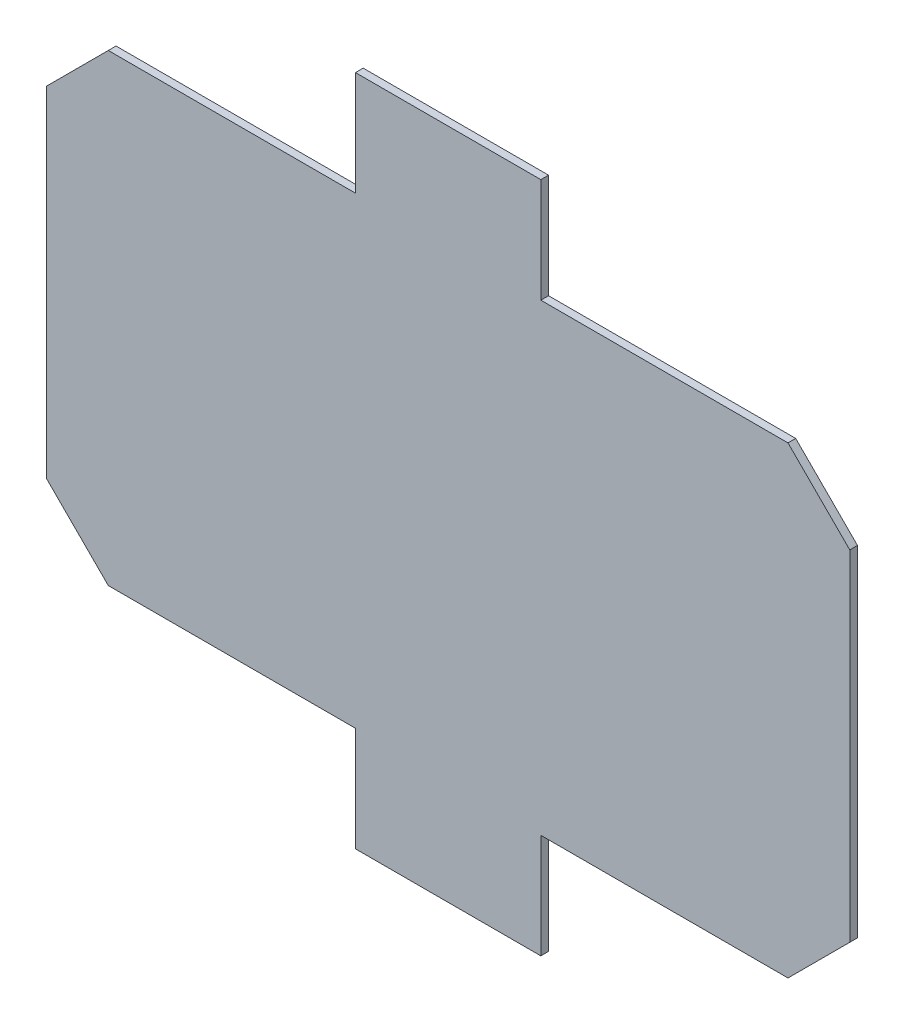
ISO-10303-21;
HEADER;
FILE_DESCRIPTION(('STEP AP214'),'2;1');
FILE_NAME('part.step','',(''),(''),'','','');
FILE_SCHEMA(('AUTOMOTIVE_DESIGN { 1 0 10303 214 1 1 1 1 }'));
ENDSEC;
DATA;
#1=APPLICATION_CONTEXT('core data for automotive mechanical design processes');
#2=APPLICATION_PROTOCOL_DEFINITION('international standard','automotive_design',2000,#1);
#3=PRODUCT_CONTEXT('',#1,'mechanical');
#4=PRODUCT('Part','Part','',(#3));
#5=PRODUCT_RELATED_PRODUCT_CATEGORY('part','',(#4));
#6=PRODUCT_DEFINITION_FORMATION('','',#4);
#7=PRODUCT_DEFINITION_CONTEXT('part definition',#1,'design');
#8=PRODUCT_DEFINITION('design','',#6,#7);
#9=PRODUCT_DEFINITION_SHAPE('','',#8);
#10=(LENGTH_UNIT() NAMED_UNIT(*) SI_UNIT(.MILLI.,.METRE.));
#11=(NAMED_UNIT(*) PLANE_ANGLE_UNIT() SI_UNIT($,.RADIAN.));
#12=(NAMED_UNIT(*) SI_UNIT($,.STERADIAN.) SOLID_ANGLE_UNIT());
#13=UNCERTAINTY_MEASURE_WITH_UNIT(LENGTH_MEASURE(1.E-05),#10,'distance_accuracy_value','');
#14=(GEOMETRIC_REPRESENTATION_CONTEXT(3) GLOBAL_UNCERTAINTY_ASSIGNED_CONTEXT((#13)) GLOBAL_UNIT_ASSIGNED_CONTEXT((#10,
#11,#12)) REPRESENTATION_CONTEXT('',''));
#15=CARTESIAN_POINT('',(0.,0.,0.));
#16=DIRECTION('',(0.,0.,1.));
#17=DIRECTION('',(1.,0.,0.));
#18=AXIS2_PLACEMENT_3D('',#15,#16,#17);
#19=CARTESIAN_POINT('',(-59.9999999999999,0.,5.));
#20=DIRECTION('',(-1.,0.,0.));
#21=DIRECTION('',(0.,0.,1.));
#22=AXIS2_PLACEMENT_3D('',#19,#20,#21);
#23=PLANE('',#22);
#24=DIRECTION('',(0.,1.,0.));
#25=VECTOR('',#24,1.);
#26=CARTESIAN_POINT('',(-59.9999999999999,0.,0.));
#27=LINE('',#26,#25);
#28=CARTESIAN_POINT('',(-59.9999999999999,325.,0.));
#29=VERTEX_POINT('',#28);
#30=CARTESIAN_POINT('',(-59.9999999999999,392.6,0.));
#31=VERTEX_POINT('',#30);
#32=EDGE_CURVE('E166',#29,#31,#27,.T.);
#33=ORIENTED_EDGE('',*,*,#32,.F.);
#34=DIRECTION('',(0.,0.,-1.));
#35=VECTOR('',#34,1.);
#36=CARTESIAN_POINT('',(-59.9999999999999,325.,5.));
#37=LINE('',#36,#35);
#38=CARTESIAN_POINT('',(-59.9999999999999,325.,5.));
#39=VERTEX_POINT('',#38);
#40=EDGE_CURVE('E154',#39,#29,#37,.T.);
#41=ORIENTED_EDGE('',*,*,#40,.F.);
#42=DIRECTION('',(0.,1.,0.));
#43=VECTOR('',#42,1.);
#44=CARTESIAN_POINT('',(-59.9999999999999,0.,5.));
#45=LINE('',#44,#43);
#46=CARTESIAN_POINT('',(-59.9999999999999,392.6,5.));
#47=VERTEX_POINT('',#46);
#48=EDGE_CURVE('E160',#39,#47,#45,.T.);
#49=ORIENTED_EDGE('',*,*,#48,.T.);
#50=DIRECTION('',(0.,0.,-1.));
#51=VECTOR('',#50,1.);
#52=CARTESIAN_POINT('',(-59.9999999999999,392.6,5.));
#53=LINE('',#52,#51);
#54=EDGE_CURVE('E200',#47,#31,#53,.T.);
#55=ORIENTED_EDGE('',*,*,#54,.T.);
#56=EDGE_LOOP('',(#33,#41,#49,#55));
#57=FACE_BOUND('',#56,.T.);
#58=ADVANCED_FACE('F35',(#57),#23,.T.);
#59=CARTESIAN_POINT('',(0.,325.,5.));
#60=DIRECTION('',(0.,1.,0.));
#61=DIRECTION('',(0.,0.,1.));
#62=AXIS2_PLACEMENT_3D('',#59,#60,#61);
#63=PLANE('',#62);
#64=DIRECTION('',(1.,0.,0.));
#65=VECTOR('',#64,1.);
#66=CARTESIAN_POINT('',(0.,325.,0.));
#67=LINE('',#66,#65);
#68=CARTESIAN_POINT('',(-220.,325.,0.));
#69=VERTEX_POINT('',#68);
#70=EDGE_CURVE('E202',#69,#29,#67,.T.);
#71=ORIENTED_EDGE('',*,*,#70,.F.);
#72=DIRECTION('',(0.,0.,1.));
#73=VECTOR('',#72,1.);
#74=CARTESIAN_POINT('',(-220.,325.,5.));
#75=LINE('',#74,#73);
#76=CARTESIAN_POINT('',(-220.,325.,5.));
#77=VERTEX_POINT('',#76);
#78=EDGE_CURVE('E43',#69,#77,#75,.T.);
#79=ORIENTED_EDGE('',*,*,#78,.T.);
#80=DIRECTION('',(1.,0.,0.));
#81=VECTOR('',#80,1.);
#82=CARTESIAN_POINT('',(0.,325.,5.));
#83=LINE('',#82,#81);
#84=EDGE_CURVE('E150',#77,#39,#83,.T.);
#85=ORIENTED_EDGE('',*,*,#84,.T.);
#86=ORIENTED_EDGE('',*,*,#40,.T.);
#87=EDGE_LOOP('',(#71,#79,#85,#86));
#88=FACE_BOUND('',#87,.T.);
#89=ADVANCED_FACE('F153',(#88),#63,.T.);
#90=CARTESIAN_POINT('',(-260.,0.,5.));
#91=DIRECTION('',(-1.,0.,0.));
#92=DIRECTION('',(0.,0.,1.));
#93=AXIS2_PLACEMENT_3D('',#90,#91,#92);
#94=PLANE('',#93);
#95=DIRECTION('',(0.,1.,0.));
#96=VECTOR('',#95,1.);
#97=CARTESIAN_POINT('',(-260.,0.,5.));
#98=LINE('',#97,#96);
#99=CARTESIAN_POINT('',(-260.,65.0000000000002,5.));
#100=VERTEX_POINT('',#99);
#101=CARTESIAN_POINT('',(-260.,285.,5.));
#102=VERTEX_POINT('',#101);
#103=EDGE_CURVE('E159',#100,#102,#98,.T.);
#104=ORIENTED_EDGE('',*,*,#103,.T.);
#105=DIRECTION('',(0.,0.,-1.));
#106=VECTOR('',#105,1.);
#107=CARTESIAN_POINT('',(-260.,285.,5.));
#108=LINE('',#107,#106);
#109=CARTESIAN_POINT('',(-260.,285.,0.));
#110=VERTEX_POINT('',#109);
#111=EDGE_CURVE('E267',#102,#110,#108,.T.);
#112=ORIENTED_EDGE('',*,*,#111,.T.);
#113=DIRECTION('',(0.,1.,0.));
#114=VECTOR('',#113,1.);
#115=CARTESIAN_POINT('',(-260.,0.,0.));
#116=LINE('',#115,#114);
#117=CARTESIAN_POINT('',(-260.,65.0000000000002,0.));
#118=VERTEX_POINT('',#117);
#119=EDGE_CURVE('E204',#118,#110,#116,.T.);
#120=ORIENTED_EDGE('',*,*,#119,.F.);
#121=DIRECTION('',(0.,0.,1.));
#122=VECTOR('',#121,1.);
#123=CARTESIAN_POINT('',(-260.,65.0000000000002,5.));
#124=LINE('',#123,#122);
#125=EDGE_CURVE('E265',#118,#100,#124,.T.);
#126=ORIENTED_EDGE('',*,*,#125,.T.);
#127=EDGE_LOOP('',(#104,#112,#120,#126));
#128=FACE_BOUND('',#127,.T.);
#129=ADVANCED_FACE('F272',(#128),#94,.T.);
#130=CARTESIAN_POINT('',(0.,25.,5.));
#131=DIRECTION('',(0.,1.,0.));
#132=DIRECTION('',(0.,0.,1.));
#133=AXIS2_PLACEMENT_3D('',#130,#131,#132);
#134=PLANE('',#133);
#135=DIRECTION('',(1.,0.,0.));
#136=VECTOR('',#135,1.);
#137=CARTESIAN_POINT('',(0.,25.,5.));
#138=LINE('',#137,#136);
#139=CARTESIAN_POINT('',(-220.,25.,5.));
#140=VERTEX_POINT('',#139);
#141=CARTESIAN_POINT('',(-59.9999999999999,25.,5.));
#142=VERTEX_POINT('',#141);
#143=EDGE_CURVE('E182',#140,#142,#138,.T.);
#144=ORIENTED_EDGE('',*,*,#143,.F.);
#145=DIRECTION('',(0.,0.,-1.));
#146=VECTOR('',#145,1.);
#147=CARTESIAN_POINT('',(-220.,25.,0.));
#148=LINE('',#147,#146);
#149=CARTESIAN_POINT('',(-220.,25.,0.));
#150=VERTEX_POINT('',#149);
#151=EDGE_CURVE('E11',#140,#150,#148,.T.);
#152=ORIENTED_EDGE('',*,*,#151,.T.);
#153=DIRECTION('',(1.,0.,0.));
#154=VECTOR('',#153,1.);
#155=CARTESIAN_POINT('',(0.,25.,0.));
#156=LINE('',#155,#154);
#157=CARTESIAN_POINT('',(-59.9999999999999,25.,0.));
#158=VERTEX_POINT('',#157);
#159=EDGE_CURVE('E207',#150,#158,#156,.T.);
#160=ORIENTED_EDGE('',*,*,#159,.T.);
#161=DIRECTION('',(0.,0.,-1.));
#162=VECTOR('',#161,1.);
#163=CARTESIAN_POINT('',(-59.9999999999999,25.,5.));
#164=LINE('',#163,#162);
#165=EDGE_CURVE('E168',#142,#158,#164,.T.);
#166=ORIENTED_EDGE('',*,*,#165,.F.);
#167=EDGE_LOOP('',(#144,#152,#160,#166));
#168=FACE_BOUND('',#167,.T.);
#169=ADVANCED_FACE('F282',(#168),#134,.F.);
#170=CARTESIAN_POINT('',(-59.9999999999999,0.,5.));
#171=DIRECTION('',(-1.,0.,0.));
#172=DIRECTION('',(0.,0.,1.));
#173=AXIS2_PLACEMENT_3D('',#170,#171,#172);
#174=PLANE('',#173);
#175=DIRECTION('',(0.,1.,0.));
#176=VECTOR('',#175,1.);
#177=CARTESIAN_POINT('',(-59.9999999999999,0.,0.));
#178=LINE('',#177,#176);
#179=CARTESIAN_POINT('',(-59.9999999999999,-42.6,0.));
#180=VERTEX_POINT('',#179);
#181=EDGE_CURVE('E209',#180,#158,#178,.T.);
#182=ORIENTED_EDGE('',*,*,#181,.F.);
#183=DIRECTION('',(0.,0.,-1.));
#184=VECTOR('',#183,1.);
#185=CARTESIAN_POINT('',(-59.9999999999999,-42.6,5.));
#186=LINE('',#185,#184);
#187=CARTESIAN_POINT('',(-59.9999999999999,-42.6,5.));
#188=VERTEX_POINT('',#187);
#189=EDGE_CURVE('E238',#188,#180,#186,.T.);
#190=ORIENTED_EDGE('',*,*,#189,.F.);
#191=DIRECTION('',(0.,1.,0.));
#192=VECTOR('',#191,1.);
#193=CARTESIAN_POINT('',(-59.9999999999999,0.,5.));
#194=LINE('',#193,#192);
#195=EDGE_CURVE('E184',#188,#142,#194,.T.);
#196=ORIENTED_EDGE('',*,*,#195,.T.);
#197=ORIENTED_EDGE('',*,*,#165,.T.);
#198=EDGE_LOOP('',(#182,#190,#196,#197));
#199=FACE_BOUND('',#198,.T.);
#200=ADVANCED_FACE('F289',(#199),#174,.T.);
#201=CARTESIAN_POINT('',(0.,-42.6,5.));
#202=DIRECTION('',(0.,1.,0.));
#203=DIRECTION('',(0.,0.,1.));
#204=AXIS2_PLACEMENT_3D('',#201,#202,#203);
#205=PLANE('',#204);
#206=DIRECTION('',(1.,0.,0.));
#207=VECTOR('',#206,1.);
#208=CARTESIAN_POINT('',(0.,-42.6,0.));
#209=LINE('',#208,#207);
#210=CARTESIAN_POINT('',(60.0000000000001,-42.6,0.));
#211=VERTEX_POINT('',#210);
#212=EDGE_CURVE('E212',#180,#211,#209,.T.);
#213=ORIENTED_EDGE('',*,*,#212,.T.);
#214=DIRECTION('',(0.,0.,-1.));
#215=VECTOR('',#214,1.);
#216=CARTESIAN_POINT('',(60.0000000000001,-42.6,5.));
#217=LINE('',#216,#215);
#218=CARTESIAN_POINT('',(60.0000000000001,-42.6,5.));
#219=VERTEX_POINT('',#218);
#220=EDGE_CURVE('E235',#219,#211,#217,.T.);
#221=ORIENTED_EDGE('',*,*,#220,.F.);
#222=DIRECTION('',(1.,0.,0.));
#223=VECTOR('',#222,1.);
#224=CARTESIAN_POINT('',(0.,-42.6,5.));
#225=LINE('',#224,#223);
#226=EDGE_CURVE('E187',#188,#219,#225,.T.);
#227=ORIENTED_EDGE('',*,*,#226,.F.);
#228=ORIENTED_EDGE('',*,*,#189,.T.);
#229=EDGE_LOOP('',(#213,#221,#227,#228));
#230=FACE_BOUND('',#229,.T.);
#231=ADVANCED_FACE('F292',(#230),#205,.F.);
#232=CARTESIAN_POINT('',(60.0000000000001,0.,5.));
#233=DIRECTION('',(-1.,0.,0.));
#234=DIRECTION('',(0.,0.,1.));
#235=AXIS2_PLACEMENT_3D('',#232,#233,#234);
#236=PLANE('',#235);
#237=DIRECTION('',(0.,1.,0.));
#238=VECTOR('',#237,1.);
#239=CARTESIAN_POINT('',(60.0000000000001,0.,0.));
#240=LINE('',#239,#238);
#241=CARTESIAN_POINT('',(60.0000000000001,25.,0.));
#242=VERTEX_POINT('',#241);
#243=EDGE_CURVE('E214',#211,#242,#240,.T.);
#244=ORIENTED_EDGE('',*,*,#243,.T.);
#245=DIRECTION('',(0.,0.,-1.));
#246=VECTOR('',#245,1.);
#247=CARTESIAN_POINT('',(60.0000000000001,25.,5.));
#248=LINE('',#247,#246);
#249=CARTESIAN_POINT('',(60.0000000000001,25.,5.));
#250=VERTEX_POINT('',#249);
#251=EDGE_CURVE('E232',#250,#242,#248,.T.);
#252=ORIENTED_EDGE('',*,*,#251,.F.);
#253=DIRECTION('',(0.,1.,0.));
#254=VECTOR('',#253,1.);
#255=CARTESIAN_POINT('',(60.0000000000001,0.,5.));
#256=LINE('',#255,#254);
#257=EDGE_CURVE('E189',#219,#250,#256,.T.);
#258=ORIENTED_EDGE('',*,*,#257,.F.);
#259=ORIENTED_EDGE('',*,*,#220,.T.);
#260=EDGE_LOOP('',(#244,#252,#258,#259));
#261=FACE_BOUND('',#260,.T.);
#262=ADVANCED_FACE('F297',(#261),#236,.F.);
#263=CARTESIAN_POINT('',(0.,25.,5.));
#264=DIRECTION('',(0.,1.,0.));
#265=DIRECTION('',(0.,0.,1.));
#266=AXIS2_PLACEMENT_3D('',#263,#264,#265);
#267=PLANE('',#266);
#268=DIRECTION('',(1.,0.,0.));
#269=VECTOR('',#268,1.);
#270=CARTESIAN_POINT('',(0.,25.,0.));
#271=LINE('',#270,#269);
#272=CARTESIAN_POINT('',(220.,25.,0.));
#273=VERTEX_POINT('',#272);
#274=EDGE_CURVE('E216',#242,#273,#271,.T.);
#275=ORIENTED_EDGE('',*,*,#274,.T.);
#276=DIRECTION('',(0.,0.,1.));
#277=VECTOR('',#276,1.);
#278=CARTESIAN_POINT('',(220.,25.,5.));
#279=LINE('',#278,#277);
#280=CARTESIAN_POINT('',(220.,25.,5.));
#281=VERTEX_POINT('',#280);
#282=EDGE_CURVE('E254',#273,#281,#279,.T.);
#283=ORIENTED_EDGE('',*,*,#282,.T.);
#284=DIRECTION('',(1.,0.,0.));
#285=VECTOR('',#284,1.);
#286=CARTESIAN_POINT('',(0.,25.,5.));
#287=LINE('',#286,#285);
#288=EDGE_CURVE('E191',#250,#281,#287,.T.);
#289=ORIENTED_EDGE('',*,*,#288,.F.);
#290=ORIENTED_EDGE('',*,*,#251,.T.);
#291=EDGE_LOOP('',(#275,#283,#289,#290));
#292=FACE_BOUND('',#291,.T.);
#293=ADVANCED_FACE('F357',(#292),#267,.F.);
#294=CARTESIAN_POINT('',(260.,0.,5.));
#295=DIRECTION('',(-1.,0.,0.));
#296=DIRECTION('',(0.,0.,1.));
#297=AXIS2_PLACEMENT_3D('',#294,#295,#296);
#298=PLANE('',#297);
#299=DIRECTION('',(0.,1.,0.));
#300=VECTOR('',#299,1.);
#301=CARTESIAN_POINT('',(260.,0.,5.));
#302=LINE('',#301,#300);
#303=CARTESIAN_POINT('',(260.,65.0000000000001,5.));
#304=VERTEX_POINT('',#303);
#305=CARTESIAN_POINT('',(260.,285.,5.));
#306=VERTEX_POINT('',#305);
#307=EDGE_CURVE('E193',#304,#306,#302,.T.);
#308=ORIENTED_EDGE('',*,*,#307,.F.);
#309=DIRECTION('',(0.,0.,-1.));
#310=VECTOR('',#309,1.);
#311=CARTESIAN_POINT('',(260.,65.0000000000001,5.));
#312=LINE('',#311,#310);
#313=CARTESIAN_POINT('',(260.,65.0000000000001,0.));
#314=VERTEX_POINT('',#313);
#315=EDGE_CURVE('E243',#304,#314,#312,.T.);
#316=ORIENTED_EDGE('',*,*,#315,.T.);
#317=DIRECTION('',(0.,1.,0.));
#318=VECTOR('',#317,1.);
#319=CARTESIAN_POINT('',(260.,0.,0.));
#320=LINE('',#319,#318);
#321=CARTESIAN_POINT('',(260.,285.,0.));
#322=VERTEX_POINT('',#321);
#323=EDGE_CURVE('E219',#314,#322,#320,.T.);
#324=ORIENTED_EDGE('',*,*,#323,.T.);
#325=DIRECTION('',(0.,0.,1.));
#326=VECTOR('',#325,1.);
#327=CARTESIAN_POINT('',(260.,285.,5.));
#328=LINE('',#327,#326);
#329=EDGE_CURVE('E167',#322,#306,#328,.T.);
#330=ORIENTED_EDGE('',*,*,#329,.T.);
#331=EDGE_LOOP('',(#308,#316,#324,#330));
#332=FACE_BOUND('',#331,.T.);
#333=ADVANCED_FACE('F307',(#332),#298,.F.);
#334=CARTESIAN_POINT('',(0.,325.,5.));
#335=DIRECTION('',(0.,1.,0.));
#336=DIRECTION('',(0.,0.,1.));
#337=AXIS2_PLACEMENT_3D('',#334,#335,#336);
#338=PLANE('',#337);
#339=DIRECTION('',(1.,0.,0.));
#340=VECTOR('',#339,1.);
#341=CARTESIAN_POINT('',(0.,325.,5.));
#342=LINE('',#341,#340);
#343=CARTESIAN_POINT('',(60.0000000000001,325.,5.));
#344=VERTEX_POINT('',#343);
#345=CARTESIAN_POINT('',(220.,325.,5.));
#346=VERTEX_POINT('',#345);
#347=EDGE_CURVE('E195',#344,#346,#342,.T.);
#348=ORIENTED_EDGE('',*,*,#347,.T.);
#349=DIRECTION('',(0.,0.,-1.));
#350=VECTOR('',#349,1.);
#351=CARTESIAN_POINT('',(220.,325.,0.));
#352=LINE('',#351,#350);
#353=CARTESIAN_POINT('',(220.,325.,0.));
#354=VERTEX_POINT('',#353);
#355=EDGE_CURVE('E262',#346,#354,#352,.T.);
#356=ORIENTED_EDGE('',*,*,#355,.T.);
#357=DIRECTION('',(1.,0.,0.));
#358=VECTOR('',#357,1.);
#359=CARTESIAN_POINT('',(0.,325.,0.));
#360=LINE('',#359,#358);
#361=CARTESIAN_POINT('',(60.0000000000001,325.,0.));
#362=VERTEX_POINT('',#361);
#363=EDGE_CURVE('E222',#362,#354,#360,.T.);
#364=ORIENTED_EDGE('',*,*,#363,.F.);
#365=DIRECTION('',(0.,0.,-1.));
#366=VECTOR('',#365,1.);
#367=CARTESIAN_POINT('',(60.0000000000001,325.,5.));
#368=LINE('',#367,#366);
#369=EDGE_CURVE('E230',#344,#362,#368,.T.);
#370=ORIENTED_EDGE('',*,*,#369,.F.);
#371=EDGE_LOOP('',(#348,#356,#364,#370));
#372=FACE_BOUND('',#371,.T.);
#373=ADVANCED_FACE('F316',(#372),#338,.T.);
#374=CARTESIAN_POINT('',(60.0000000000001,0.,5.));
#375=DIRECTION('',(-1.,0.,0.));
#376=DIRECTION('',(0.,0.,1.));
#377=AXIS2_PLACEMENT_3D('',#374,#375,#376);
#378=PLANE('',#377);
#379=DIRECTION('',(0.,1.,0.));
#380=VECTOR('',#379,1.);
#381=CARTESIAN_POINT('',(60.0000000000001,0.,0.));
#382=LINE('',#381,#380);
#383=CARTESIAN_POINT('',(60.0000000000001,392.6,0.));
#384=VERTEX_POINT('',#383);
#385=EDGE_CURVE('E177',#362,#384,#382,.T.);
#386=ORIENTED_EDGE('',*,*,#385,.T.);
#387=DIRECTION('',(0.,0.,-1.));
#388=VECTOR('',#387,1.);
#389=CARTESIAN_POINT('',(60.0000000000001,392.6,5.));
#390=LINE('',#389,#388);
#391=CARTESIAN_POINT('',(60.0000000000001,392.6,5.));
#392=VERTEX_POINT('',#391);
#393=EDGE_CURVE('E228',#392,#384,#390,.T.);
#394=ORIENTED_EDGE('',*,*,#393,.F.);
#395=DIRECTION('',(0.,1.,0.));
#396=VECTOR('',#395,1.);
#397=CARTESIAN_POINT('',(60.0000000000001,0.,5.));
#398=LINE('',#397,#396);
#399=EDGE_CURVE('E197',#344,#392,#398,.T.);
#400=ORIENTED_EDGE('',*,*,#399,.F.);
#401=ORIENTED_EDGE('',*,*,#369,.T.);
#402=EDGE_LOOP('',(#386,#394,#400,#401));
#403=FACE_BOUND('',#402,.T.);
#404=ADVANCED_FACE('F320',(#403),#378,.F.);
#405=CARTESIAN_POINT('',(0.,392.6,5.));
#406=DIRECTION('',(0.,1.,0.));
#407=DIRECTION('',(0.,0.,1.));
#408=AXIS2_PLACEMENT_3D('',#405,#406,#407);
#409=PLANE('',#408);
#410=DIRECTION('',(1.,0.,0.));
#411=VECTOR('',#410,1.);
#412=CARTESIAN_POINT('',(0.,392.6,0.));
#413=LINE('',#412,#411);
#414=EDGE_CURVE('E174',#31,#384,#413,.T.);
#415=ORIENTED_EDGE('',*,*,#414,.F.);
#416=ORIENTED_EDGE('',*,*,#54,.F.);
#417=DIRECTION('',(1.,0.,0.));
#418=VECTOR('',#417,1.);
#419=CARTESIAN_POINT('',(0.,392.6,5.));
#420=LINE('',#419,#418);
#421=EDGE_CURVE('E173',#47,#392,#420,.T.);
#422=ORIENTED_EDGE('',*,*,#421,.T.);
#423=ORIENTED_EDGE('',*,*,#393,.T.);
#424=EDGE_LOOP('',(#415,#416,#422,#423));
#425=FACE_BOUND('',#424,.T.);
#426=ADVANCED_FACE('F323',(#425),#409,.T.);
#427=CARTESIAN_POINT('',(0.,0.,5.));
#428=DIRECTION('',(0.,0.,1.));
#429=DIRECTION('',(1.,0.,0.));
#430=AXIS2_PLACEMENT_3D('',#427,#428,#429);
#431=PLANE('',#430);
#432=ORIENTED_EDGE('',*,*,#288,.T.);
#433=DIRECTION('',(-0.707106781186549,-0.707106781186547,0.));
#434=VECTOR('',#433,1.);
#435=CARTESIAN_POINT('',(97.4999999999997,-97.5,5.));
#436=LINE('',#435,#434);
#437=EDGE_CURVE('E260',#281,#304,#436,.F.);
#438=ORIENTED_EDGE('',*,*,#437,.T.);
#439=ORIENTED_EDGE('',*,*,#307,.T.);
#440=DIRECTION('',(-0.707106781186547,0.707106781186549,0.));
#441=VECTOR('',#440,1.);
#442=CARTESIAN_POINT('',(272.5,272.5,5.));
#443=LINE('',#442,#441);
#444=EDGE_CURVE('E50',#306,#346,#443,.T.);
#445=ORIENTED_EDGE('',*,*,#444,.T.);
#446=ORIENTED_EDGE('',*,*,#347,.F.);
#447=ORIENTED_EDGE('',*,*,#399,.T.);
#448=ORIENTED_EDGE('',*,*,#421,.F.);
#449=ORIENTED_EDGE('',*,*,#48,.F.);
#450=ORIENTED_EDGE('',*,*,#84,.F.);
#451=DIRECTION('',(0.707106781186549,0.707106781186547,0.));
#452=VECTOR('',#451,1.);
#453=CARTESIAN_POINT('',(-272.5,272.5,5.));
#454=LINE('',#453,#452);
#455=EDGE_CURVE('E257',#77,#102,#454,.F.);
#456=ORIENTED_EDGE('',*,*,#455,.T.);
#457=ORIENTED_EDGE('',*,*,#103,.F.);
#458=DIRECTION('',(0.707106781186547,-0.707106781186549,0.));
#459=VECTOR('',#458,1.);
#460=CARTESIAN_POINT('',(-97.5000000000003,-97.5,5.));
#461=LINE('',#460,#459);
#462=EDGE_CURVE('E57',#100,#140,#461,.T.);
#463=ORIENTED_EDGE('',*,*,#462,.T.);
#464=ORIENTED_EDGE('',*,*,#143,.T.);
#465=ORIENTED_EDGE('',*,*,#195,.F.);
#466=ORIENTED_EDGE('',*,*,#226,.T.);
#467=ORIENTED_EDGE('',*,*,#257,.T.);
#468=EDGE_LOOP('',(#432,#438,#439,#445,#446,#447,#448,#449,#450,#456,#457,#463,#464,#465,#466,#467));
#469=FACE_BOUND('',#468,.T.);
#470=ADVANCED_FACE('F171',(#469),#431,.T.);
#471=CARTESIAN_POINT('',(0.,0.,0.));
#472=DIRECTION('',(0.,0.,1.));
#473=DIRECTION('',(1.,0.,0.));
#474=AXIS2_PLACEMENT_3D('',#471,#472,#473);
#475=PLANE('',#474);
#476=ORIENTED_EDGE('',*,*,#323,.F.);
#477=DIRECTION('',(0.707106781186549,0.707106781186547,0.));
#478=VECTOR('',#477,1.);
#479=CARTESIAN_POINT('',(260.,65.0000000000001,0.));
#480=LINE('',#479,#478);
#481=EDGE_CURVE('E252',#314,#273,#480,.F.);
#482=ORIENTED_EDGE('',*,*,#481,.T.);
#483=ORIENTED_EDGE('',*,*,#274,.F.);
#484=ORIENTED_EDGE('',*,*,#243,.F.);
#485=ORIENTED_EDGE('',*,*,#212,.F.);
#486=ORIENTED_EDGE('',*,*,#181,.T.);
#487=ORIENTED_EDGE('',*,*,#159,.F.);
#488=DIRECTION('',(-0.707106781186547,0.707106781186549,0.));
#489=VECTOR('',#488,1.);
#490=CARTESIAN_POINT('',(-220.,25.,0.));
#491=LINE('',#490,#489);
#492=EDGE_CURVE('E246',#150,#118,#491,.T.);
#493=ORIENTED_EDGE('',*,*,#492,.T.);
#494=ORIENTED_EDGE('',*,*,#119,.T.);
#495=DIRECTION('',(-0.707106781186549,-0.707106781186547,0.));
#496=VECTOR('',#495,1.);
#497=CARTESIAN_POINT('',(-260.,285.,0.));
#498=LINE('',#497,#496);
#499=EDGE_CURVE('E248',#110,#69,#498,.F.);
#500=ORIENTED_EDGE('',*,*,#499,.T.);
#501=ORIENTED_EDGE('',*,*,#70,.T.);
#502=ORIENTED_EDGE('',*,*,#32,.T.);
#503=ORIENTED_EDGE('',*,*,#414,.T.);
#504=ORIENTED_EDGE('',*,*,#385,.F.);
#505=ORIENTED_EDGE('',*,*,#363,.T.);
#506=DIRECTION('',(0.707106781186547,-0.707106781186549,0.));
#507=VECTOR('',#506,1.);
#508=CARTESIAN_POINT('',(220.,325.,0.));
#509=LINE('',#508,#507);
#510=EDGE_CURVE('E250',#354,#322,#509,.T.);
#511=ORIENTED_EDGE('',*,*,#510,.T.);
#512=EDGE_LOOP('',(#476,#482,#483,#484,#485,#486,#487,#493,#494,#500,#501,#502,#503,#504,#505,#511));
#513=FACE_BOUND('',#512,.T.);
#514=ADVANCED_FACE('F277',(#513),#475,.F.);
#515=CARTESIAN_POINT('',(260.,65.0000000000001,5.));
#516=DIRECTION('',(-0.707106781186547,0.707106781186549,0.));
#517=DIRECTION('',(0.,0.,-1.));
#518=AXIS2_PLACEMENT_3D('',#515,#516,#517);
#519=PLANE('',#518);
#520=ORIENTED_EDGE('',*,*,#437,.F.);
#521=ORIENTED_EDGE('',*,*,#282,.F.);
#522=ORIENTED_EDGE('',*,*,#481,.F.);
#523=ORIENTED_EDGE('',*,*,#315,.F.);
#524=EDGE_LOOP('',(#520,#521,#522,#523));
#525=FACE_BOUND('',#524,.T.);
#526=ADVANCED_FACE('F305',(#525),#519,.F.);
#527=CARTESIAN_POINT('',(220.,325.,5.));
#528=DIRECTION('',(0.707106781186549,0.707106781186547,0.));
#529=DIRECTION('',(0.,0.,1.));
#530=AXIS2_PLACEMENT_3D('',#527,#528,#529);
#531=PLANE('',#530);
#532=ORIENTED_EDGE('',*,*,#444,.F.);
#533=ORIENTED_EDGE('',*,*,#329,.F.);
#534=ORIENTED_EDGE('',*,*,#510,.F.);
#535=ORIENTED_EDGE('',*,*,#355,.F.);
#536=EDGE_LOOP('',(#532,#533,#534,#535));
#537=FACE_BOUND('',#536,.T.);
#538=ADVANCED_FACE('F314',(#537),#531,.T.);
#539=CARTESIAN_POINT('',(-260.,285.,5.));
#540=DIRECTION('',(0.707106781186547,-0.707106781186549,0.));
#541=DIRECTION('',(0.,0.,-1.));
#542=AXIS2_PLACEMENT_3D('',#539,#540,#541);
#543=PLANE('',#542);
#544=ORIENTED_EDGE('',*,*,#455,.F.);
#545=ORIENTED_EDGE('',*,*,#78,.F.);
#546=ORIENTED_EDGE('',*,*,#499,.F.);
#547=ORIENTED_EDGE('',*,*,#111,.F.);
#548=EDGE_LOOP('',(#544,#545,#546,#547));
#549=FACE_BOUND('',#548,.T.);
#550=ADVANCED_FACE('F324',(#549),#543,.F.);
#551=CARTESIAN_POINT('',(-220.,25.,5.));
#552=DIRECTION('',(-0.707106781186549,-0.707106781186547,0.));
#553=DIRECTION('',(0.,0.,1.));
#554=AXIS2_PLACEMENT_3D('',#551,#552,#553);
#555=PLANE('',#554);
#556=ORIENTED_EDGE('',*,*,#462,.F.);
#557=ORIENTED_EDGE('',*,*,#125,.F.);
#558=ORIENTED_EDGE('',*,*,#492,.F.);
#559=ORIENTED_EDGE('',*,*,#151,.F.);
#560=EDGE_LOOP('',(#556,#557,#558,#559));
#561=FACE_BOUND('',#560,.T.);
#562=ADVANCED_FACE('F37',(#561),#555,.T.);
#563=CLOSED_SHELL('',(#58,#89,#129,#169,#200,#231,#262,#293,#333,#373,#404,#426,#470,#514,#526,
#538,#550,#562));
#564=MANIFOLD_SOLID_BREP('B2',#563);
#565=ADVANCED_BREP_SHAPE_REPRESENTATION('',(#18,#564),#14);
#566=SHAPE_DEFINITION_REPRESENTATION(#9,#565);
ENDSEC;
END-ISO-10303-21;
